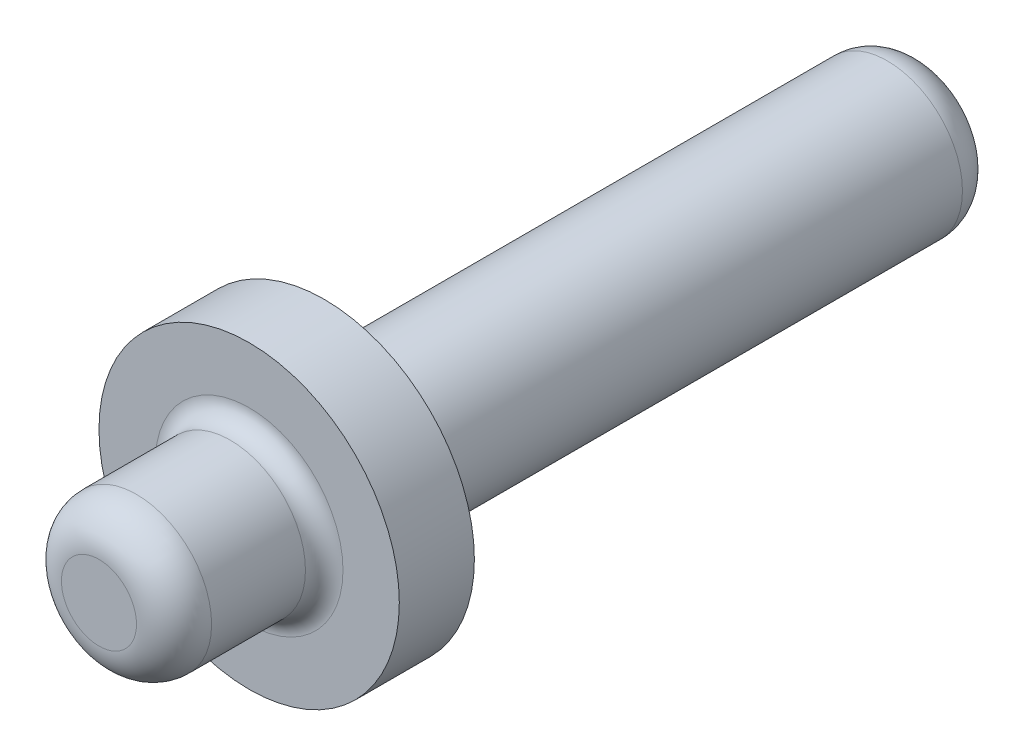
ISO-10303-21;
HEADER;
FILE_DESCRIPTION(('STEP AP214'),'2;1');
FILE_NAME('part.step','',(''),(''),'','','');
FILE_SCHEMA(('AUTOMOTIVE_DESIGN { 1 0 10303 214 1 1 1 1 }'));
ENDSEC;
DATA;
#1=APPLICATION_CONTEXT('core data for automotive mechanical design processes');
#2=APPLICATION_PROTOCOL_DEFINITION('international standard','automotive_design',2000,#1);
#3=PRODUCT_CONTEXT('',#1,'mechanical');
#4=PRODUCT('Part','Part','',(#3));
#5=PRODUCT_RELATED_PRODUCT_CATEGORY('part','',(#4));
#6=PRODUCT_DEFINITION_FORMATION('','',#4);
#7=PRODUCT_DEFINITION_CONTEXT('part definition',#1,'design');
#8=PRODUCT_DEFINITION('design','',#6,#7);
#9=PRODUCT_DEFINITION_SHAPE('','',#8);
#10=(LENGTH_UNIT() NAMED_UNIT(*) SI_UNIT(.MILLI.,.METRE.));
#11=(NAMED_UNIT(*) PLANE_ANGLE_UNIT() SI_UNIT($,.RADIAN.));
#12=(NAMED_UNIT(*) SI_UNIT($,.STERADIAN.) SOLID_ANGLE_UNIT());
#13=UNCERTAINTY_MEASURE_WITH_UNIT(LENGTH_MEASURE(1.E-05),#10,'distance_accuracy_value','');
#14=(GEOMETRIC_REPRESENTATION_CONTEXT(3) GLOBAL_UNCERTAINTY_ASSIGNED_CONTEXT((#13)) GLOBAL_UNIT_ASSIGNED_CONTEXT((#10,
#11,#12)) REPRESENTATION_CONTEXT('',''));
#15=CARTESIAN_POINT('',(0.,0.,0.));
#16=DIRECTION('',(0.,0.,1.));
#17=DIRECTION('',(1.,0.,0.));
#18=AXIS2_PLACEMENT_3D('',#15,#16,#17);
#19=CARTESIAN_POINT('',(0.,0.,28.575));
#20=DIRECTION('',(0.,0.,1.));
#21=DIRECTION('',(1.,0.,0.));
#22=AXIS2_PLACEMENT_3D('',#19,#20,#21);
#23=PLANE('',#22);
#24=CARTESIAN_POINT('',(0.,0.,28.575));
#25=DIRECTION('',(0.,0.,1.));
#26=DIRECTION('',(1.,0.,0.));
#27=AXIS2_PLACEMENT_3D('',#24,#25,#26);
#28=CIRCLE('',#27,3.96875);
#29=CARTESIAN_POINT('',(3.96875,0.,28.575));
#30=VERTEX_POINT('',#29);
#31=EDGE_CURVE('E10',#30,#30,#28,.F.);
#32=ORIENTED_EDGE('',*,*,#31,.T.);
#33=EDGE_LOOP('',(#32));
#34=FACE_BOUND('',#33,.T.);
#35=CARTESIAN_POINT('',(0.,0.,28.575));
#36=DIRECTION('',(0.,0.,1.));
#37=DIRECTION('',(1.,0.,0.));
#38=AXIS2_PLACEMENT_3D('',#35,#36,#37);
#39=CIRCLE('',#38,6.35);
#40=CARTESIAN_POINT('',(6.35,0.,28.575));
#41=VERTEX_POINT('',#40);
#42=EDGE_CURVE('E63',#41,#41,#39,.T.);
#43=ORIENTED_EDGE('',*,*,#42,.T.);
#44=EDGE_LOOP('',(#43));
#45=FACE_BOUND('',#44,.T.);
#46=ADVANCED_FACE('F31',(#34,#45),#23,.T.);
#47=CARTESIAN_POINT('',(0.,0.,25.4));
#48=DIRECTION('',(0.,0.,-1.));
#49=DIRECTION('',(-1.,0.,0.));
#50=AXIS2_PLACEMENT_3D('',#47,#48,#49);
#51=CYLINDRICAL_SURFACE('',#50,3.175);
#52=CARTESIAN_POINT('',(0.,0.,24.60625));
#53=DIRECTION('',(0.,0.,1.));
#54=DIRECTION('',(1.,0.,0.));
#55=AXIS2_PLACEMENT_3D('',#52,#53,#54);
#56=CIRCLE('',#55,3.175);
#57=CARTESIAN_POINT('',(3.175,0.,24.60625));
#58=VERTEX_POINT('',#57);
#59=EDGE_CURVE('E42',#58,#58,#56,.F.);
#60=ORIENTED_EDGE('',*,*,#59,.T.);
#61=EDGE_LOOP('',(#60));
#62=FACE_BOUND('',#61,.T.);
#63=CARTESIAN_POINT('',(0.,0.,1.5875));
#64=DIRECTION('',(0.,0.,1.));
#65=DIRECTION('',(1.,0.,0.));
#66=AXIS2_PLACEMENT_3D('',#63,#64,#65);
#67=CIRCLE('',#66,3.175);
#68=CARTESIAN_POINT('',(3.175,0.,1.5875));
#69=VERTEX_POINT('',#68);
#70=EDGE_CURVE('E60',#69,#69,#67,.T.);
#71=ORIENTED_EDGE('',*,*,#70,.T.);
#72=EDGE_LOOP('',(#71));
#73=FACE_BOUND('',#72,.T.);
#74=ADVANCED_FACE('F86',(#62,#73),#51,.T.);
#75=CARTESIAN_POINT('',(0.,0.,0.));
#76=DIRECTION('',(0.,0.,1.));
#77=DIRECTION('',(1.,0.,0.));
#78=AXIS2_PLACEMENT_3D('',#75,#76,#77);
#79=PLANE('',#78);
#80=CARTESIAN_POINT('',(0.,0.,0.));
#81=DIRECTION('',(0.,0.,1.));
#82=DIRECTION('',(1.,0.,0.));
#83=AXIS2_PLACEMENT_3D('',#80,#81,#82);
#84=CIRCLE('',#83,1.5875);
#85=CARTESIAN_POINT('',(1.5875,0.,0.));
#86=VERTEX_POINT('',#85);
#87=EDGE_CURVE('E57',#86,#86,#84,.F.);
#88=ORIENTED_EDGE('',*,*,#87,.T.);
#89=EDGE_LOOP('',(#88));
#90=FACE_BOUND('',#89,.T.);
#91=ADVANCED_FACE('F80',(#90),#79,.F.);
#92=CARTESIAN_POINT('',(0.,0.,25.4));
#93=DIRECTION('',(0.,0.,1.));
#94=DIRECTION('',(1.,0.,0.));
#95=AXIS2_PLACEMENT_3D('',#92,#93,#94);
#96=PLANE('',#95);
#97=CARTESIAN_POINT('',(0.,0.,25.4));
#98=DIRECTION('',(0.,0.,1.));
#99=DIRECTION('',(1.,0.,0.));
#100=AXIS2_PLACEMENT_3D('',#97,#98,#99);
#101=CIRCLE('',#100,3.96875);
#102=CARTESIAN_POINT('',(3.96875,0.,25.4));
#103=VERTEX_POINT('',#102);
#104=EDGE_CURVE('E46',#103,#103,#101,.T.);
#105=ORIENTED_EDGE('',*,*,#104,.T.);
#106=EDGE_LOOP('',(#105));
#107=FACE_BOUND('',#106,.T.);
#108=CARTESIAN_POINT('',(0.,0.,25.4));
#109=DIRECTION('',(0.,0.,1.));
#110=DIRECTION('',(1.,0.,0.));
#111=AXIS2_PLACEMENT_3D('',#108,#109,#110);
#112=CIRCLE('',#111,6.35);
#113=CARTESIAN_POINT('',(6.35,0.,25.4));
#114=VERTEX_POINT('',#113);
#115=EDGE_CURVE('E64',#114,#114,#112,.T.);
#116=ORIENTED_EDGE('',*,*,#115,.F.);
#117=EDGE_LOOP('',(#116));
#118=FACE_BOUND('',#117,.T.);
#119=ADVANCED_FACE('F75',(#107,#118),#96,.F.);
#120=CARTESIAN_POINT('',(0.,0.,28.575));
#121=DIRECTION('',(0.,0.,-1.));
#122=DIRECTION('',(-1.,0.,0.));
#123=AXIS2_PLACEMENT_3D('',#120,#121,#122);
#124=CYLINDRICAL_SURFACE('',#123,6.35);
#125=ORIENTED_EDGE('',*,*,#42,.F.);
#126=EDGE_LOOP('',(#125));
#127=FACE_BOUND('',#126,.T.);
#128=ORIENTED_EDGE('',*,*,#115,.T.);
#129=EDGE_LOOP('',(#128));
#130=FACE_BOUND('',#129,.T.);
#131=ADVANCED_FACE('F71',(#127,#130),#124,.T.);
#132=CARTESIAN_POINT('',(0.,0.,34.925));
#133=DIRECTION('',(0.,0.,-1.));
#134=DIRECTION('',(-1.,0.,0.));
#135=AXIS2_PLACEMENT_3D('',#132,#133,#134);
#136=CYLINDRICAL_SURFACE('',#135,3.175);
#137=CARTESIAN_POINT('',(0.,0.,29.36875));
#138=DIRECTION('',(0.,0.,1.));
#139=DIRECTION('',(1.,0.,0.));
#140=AXIS2_PLACEMENT_3D('',#137,#138,#139);
#141=CIRCLE('',#140,3.175);
#142=CARTESIAN_POINT('',(3.175,0.,29.36875));
#143=VERTEX_POINT('',#142);
#144=EDGE_CURVE('E38',#143,#143,#141,.T.);
#145=ORIENTED_EDGE('',*,*,#144,.T.);
#146=EDGE_LOOP('',(#145));
#147=FACE_BOUND('',#146,.T.);
#148=CARTESIAN_POINT('',(0.,0.,33.3375));
#149=DIRECTION('',(0.,0.,1.));
#150=DIRECTION('',(1.,0.,0.));
#151=AXIS2_PLACEMENT_3D('',#148,#149,#150);
#152=CIRCLE('',#151,3.175);
#153=CARTESIAN_POINT('',(3.175,0.,33.3375));
#154=VERTEX_POINT('',#153);
#155=EDGE_CURVE('E51',#154,#154,#152,.F.);
#156=ORIENTED_EDGE('',*,*,#155,.T.);
#157=EDGE_LOOP('',(#156));
#158=FACE_BOUND('',#157,.T.);
#159=ADVANCED_FACE('F74',(#147,#158),#136,.T.);
#160=CARTESIAN_POINT('',(0.,0.,34.925));
#161=DIRECTION('',(0.,0.,1.));
#162=DIRECTION('',(1.,0.,0.));
#163=AXIS2_PLACEMENT_3D('',#160,#161,#162);
#164=PLANE('',#163);
#165=CARTESIAN_POINT('',(0.,0.,34.925));
#166=DIRECTION('',(0.,0.,1.));
#167=DIRECTION('',(1.,0.,0.));
#168=AXIS2_PLACEMENT_3D('',#165,#166,#167);
#169=CIRCLE('',#168,1.5875);
#170=CARTESIAN_POINT('',(1.5875,0.,34.925));
#171=VERTEX_POINT('',#170);
#172=EDGE_CURVE('E54',#171,#171,#169,.T.);
#173=ORIENTED_EDGE('',*,*,#172,.T.);
#174=EDGE_LOOP('',(#173));
#175=FACE_BOUND('',#174,.T.);
#176=ADVANCED_FACE('F99',(#175),#164,.T.);
#177=CARTESIAN_POINT('',(0.,0.,1.5875));
#178=DIRECTION('',(0.,0.,1.));
#179=DIRECTION('',(1.,0.,0.));
#180=AXIS2_PLACEMENT_3D('',#177,#178,#179);
#181=TOROIDAL_SURFACE('',#180,1.5875,1.5875);
#182=ORIENTED_EDGE('',*,*,#87,.F.);
#183=EDGE_LOOP('',(#182));
#184=FACE_BOUND('',#183,.T.);
#185=ORIENTED_EDGE('',*,*,#70,.F.);
#186=EDGE_LOOP('',(#185));
#187=FACE_BOUND('',#186,.T.);
#188=ADVANCED_FACE('F101',(#184,#187),#181,.T.);
#189=CARTESIAN_POINT('',(0.,0.,33.3375));
#190=DIRECTION('',(0.,0.,1.));
#191=DIRECTION('',(1.,0.,0.));
#192=AXIS2_PLACEMENT_3D('',#189,#190,#191);
#193=DEGENERATE_TOROIDAL_SURFACE('',#192,1.5875,1.5875,.T.);
#194=ORIENTED_EDGE('',*,*,#155,.F.);
#195=EDGE_LOOP('',(#194));
#196=FACE_BOUND('',#195,.T.);
#197=ORIENTED_EDGE('',*,*,#172,.F.);
#198=EDGE_LOOP('',(#197));
#199=FACE_BOUND('',#198,.T.);
#200=ADVANCED_FACE('F106',(#196,#199),#193,.T.);
#201=CARTESIAN_POINT('',(0.,0.,24.60625));
#202=DIRECTION('',(0.,0.,1.));
#203=DIRECTION('',(1.,0.,0.));
#204=AXIS2_PLACEMENT_3D('',#201,#202,#203);
#205=TOROIDAL_SURFACE('',#204,3.96875,0.79375);
#206=ORIENTED_EDGE('',*,*,#59,.F.);
#207=EDGE_LOOP('',(#206));
#208=FACE_BOUND('',#207,.T.);
#209=ORIENTED_EDGE('',*,*,#104,.F.);
#210=EDGE_LOOP('',(#209));
#211=FACE_BOUND('',#210,.T.);
#212=ADVANCED_FACE('F112',(#208,#211),#205,.F.);
#213=CARTESIAN_POINT('',(0.,0.,29.36875));
#214=DIRECTION('',(0.,0.,1.));
#215=DIRECTION('',(1.,0.,0.));
#216=AXIS2_PLACEMENT_3D('',#213,#214,#215);
#217=TOROIDAL_SURFACE('',#216,3.96875,0.79375);
#218=ORIENTED_EDGE('',*,*,#31,.F.);
#219=EDGE_LOOP('',(#218));
#220=FACE_BOUND('',#219,.T.);
#221=ORIENTED_EDGE('',*,*,#144,.F.);
#222=EDGE_LOOP('',(#221));
#223=FACE_BOUND('',#222,.T.);
#224=ADVANCED_FACE('F33',(#220,#223),#217,.F.);
#225=CLOSED_SHELL('',(#46,#74,#91,#119,#131,#159,#176,#188,#200,#212,#224));
#226=MANIFOLD_SOLID_BREP('B2',#225);
#227=ADVANCED_BREP_SHAPE_REPRESENTATION('',(#18,#226),#14);
#228=SHAPE_DEFINITION_REPRESENTATION(#9,#227);
ENDSEC;
END-ISO-10303-21;
